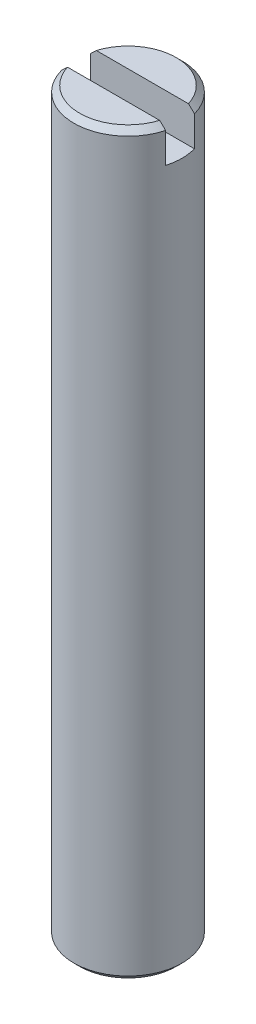
ISO-10303-21;
HEADER;
FILE_DESCRIPTION(('STEP AP214'),'2;1');
FILE_NAME('part.step','',(''),(''),'','','');
FILE_SCHEMA(('AUTOMOTIVE_DESIGN { 1 0 10303 214 1 1 1 1 }'));
ENDSEC;
DATA;
#1=APPLICATION_CONTEXT('core data for automotive mechanical design processes');
#2=APPLICATION_PROTOCOL_DEFINITION('international standard','automotive_design',2000,#1);
#3=PRODUCT_CONTEXT('',#1,'mechanical');
#4=PRODUCT('Part','Part','',(#3));
#5=PRODUCT_RELATED_PRODUCT_CATEGORY('part','',(#4));
#6=PRODUCT_DEFINITION_FORMATION('','',#4);
#7=PRODUCT_DEFINITION_CONTEXT('part definition',#1,'design');
#8=PRODUCT_DEFINITION('design','',#6,#7);
#9=PRODUCT_DEFINITION_SHAPE('','',#8);
#10=(LENGTH_UNIT() NAMED_UNIT(*) SI_UNIT(.MILLI.,.METRE.));
#11=(NAMED_UNIT(*) PLANE_ANGLE_UNIT() SI_UNIT($,.RADIAN.));
#12=(NAMED_UNIT(*) SI_UNIT($,.STERADIAN.) SOLID_ANGLE_UNIT());
#13=UNCERTAINTY_MEASURE_WITH_UNIT(LENGTH_MEASURE(1.E-05),#10,'distance_accuracy_value','');
#14=(GEOMETRIC_REPRESENTATION_CONTEXT(3) GLOBAL_UNCERTAINTY_ASSIGNED_CONTEXT((#13)) GLOBAL_UNIT_ASSIGNED_CONTEXT((#10,
#11,#12)) REPRESENTATION_CONTEXT('',''));
#15=CARTESIAN_POINT('',(0.,0.,0.));
#16=DIRECTION('',(0.,0.,1.));
#17=DIRECTION('',(1.,0.,0.));
#18=AXIS2_PLACEMENT_3D('',#15,#16,#17);
#19=CARTESIAN_POINT('',(0.,2563.,0.));
#20=DIRECTION('',(0.,1.,0.));
#21=DIRECTION('',(0.,0.,1.));
#22=AXIS2_PLACEMENT_3D('',#19,#20,#21);
#23=PLANE('',#22);
#24=DIRECTION('',(-1.,0.,0.));
#25=VECTOR('',#24,1.);
#26=CARTESIAN_POINT('',(0.,2563.,-50.));
#27=LINE('',#26,#25);
#28=CARTESIAN_POINT('',(159.863222787481,2563.,-50.));
#29=VERTEX_POINT('',#28);
#30=CARTESIAN_POINT('',(-159.863222787481,2563.,-50.));
#31=VERTEX_POINT('',#30);
#32=EDGE_CURVE('E109',#29,#31,#27,.T.);
#33=ORIENTED_EDGE('',*,*,#32,.F.);
#34=CARTESIAN_POINT('',(0.,2563.,0.));
#35=DIRECTION('',(0.,1.,0.));
#36=DIRECTION('',(0.,0.,1.));
#37=AXIS2_PLACEMENT_3D('',#34,#35,#36);
#38=CIRCLE('',#37,167.499999999999);
#39=EDGE_CURVE('E123',#29,#31,#38,.T.);
#40=ORIENTED_EDGE('',*,*,#39,.T.);
#41=EDGE_LOOP('',(#33,#40));
#42=FACE_BOUND('',#41,.T.);
#43=ADVANCED_FACE('F33',(#42),#23,.T.);
#44=CARTESIAN_POINT('',(0.,2563.,0.));
#45=DIRECTION('',(0.,-1.,0.));
#46=DIRECTION('',(0.,0.,-1.));
#47=AXIS2_PLACEMENT_3D('',#44,#45,#46);
#48=CYLINDRICAL_SURFACE('',#47,187.5);
#49=CARTESIAN_POINT('',(0.,20.,0.));
#50=DIRECTION('',(0.,1.,0.));
#51=DIRECTION('',(0.,0.,1.));
#52=AXIS2_PLACEMENT_3D('',#49,#50,#51);
#53=CIRCLE('',#52,187.5);
#54=CARTESIAN_POINT('',(0.,20.,187.5));
#55=VERTEX_POINT('',#54);
#56=EDGE_CURVE('E41',#55,#55,#53,.T.);
#57=ORIENTED_EDGE('',*,*,#56,.T.);
#58=EDGE_LOOP('',(#57));
#59=FACE_BOUND('',#58,.T.);
#60=DIRECTION('',(0.,-1.,0.));
#61=VECTOR('',#60,1.);
#62=CARTESIAN_POINT('',(-180.710403685012,2563.,-50.));
#63=LINE('',#62,#61);
#64=CARTESIAN_POINT('',(-180.710403685012,2438.,-50.));
#65=VERTEX_POINT('',#64);
#66=CARTESIAN_POINT('',(-180.710403685012,2543.,-50.));
#67=VERTEX_POINT('',#66);
#68=EDGE_CURVE('E96',#65,#67,#63,.F.);
#69=ORIENTED_EDGE('',*,*,#68,.T.);
#70=CARTESIAN_POINT('',(0.,2543.,0.));
#71=DIRECTION('',(0.,1.,0.));
#72=DIRECTION('',(0.,0.,1.));
#73=AXIS2_PLACEMENT_3D('',#70,#71,#72);
#74=CIRCLE('',#73,187.5);
#75=CARTESIAN_POINT('',(180.710403685012,2543.,-50.));
#76=VERTEX_POINT('',#75);
#77=EDGE_CURVE('E192',#67,#76,#74,.F.);
#78=ORIENTED_EDGE('',*,*,#77,.T.);
#79=DIRECTION('',(0.,-1.,0.));
#80=VECTOR('',#79,1.);
#81=CARTESIAN_POINT('',(180.710403685012,2563.,-50.));
#82=LINE('',#81,#80);
#83=CARTESIAN_POINT('',(180.710403685012,2438.,-50.));
#84=VERTEX_POINT('',#83);
#85=EDGE_CURVE('E117',#76,#84,#82,.T.);
#86=ORIENTED_EDGE('',*,*,#85,.T.);
#87=CARTESIAN_POINT('',(0.,2438.,0.));
#88=DIRECTION('',(0.,-1.,0.));
#89=DIRECTION('',(0.,0.,-1.));
#90=AXIS2_PLACEMENT_3D('',#87,#88,#89);
#91=CIRCLE('',#90,187.5);
#92=CARTESIAN_POINT('',(180.710403685012,2438.,49.9999999999999));
#93=VERTEX_POINT('',#92);
#94=EDGE_CURVE('E108',#84,#93,#91,.T.);
#95=ORIENTED_EDGE('',*,*,#94,.T.);
#96=DIRECTION('',(0.,-1.,0.));
#97=VECTOR('',#96,1.);
#98=CARTESIAN_POINT('',(180.710403685012,2563.,49.9999999999999));
#99=LINE('',#98,#97);
#100=CARTESIAN_POINT('',(180.710403685012,2543.,49.9999999999999));
#101=VERTEX_POINT('',#100);
#102=EDGE_CURVE('E97',#93,#101,#99,.F.);
#103=ORIENTED_EDGE('',*,*,#102,.T.);
#104=CARTESIAN_POINT('',(0.,2543.,0.));
#105=DIRECTION('',(0.,1.,0.));
#106=DIRECTION('',(0.,0.,1.));
#107=AXIS2_PLACEMENT_3D('',#104,#105,#106);
#108=CIRCLE('',#107,187.5);
#109=CARTESIAN_POINT('',(-180.710403685012,2543.,50.));
#110=VERTEX_POINT('',#109);
#111=EDGE_CURVE('E94',#101,#110,#108,.F.);
#112=ORIENTED_EDGE('',*,*,#111,.T.);
#113=DIRECTION('',(0.,-1.,0.));
#114=VECTOR('',#113,1.);
#115=CARTESIAN_POINT('',(-180.710403685012,2563.,50.));
#116=LINE('',#115,#114);
#117=CARTESIAN_POINT('',(-180.710403685012,2438.,50.));
#118=VERTEX_POINT('',#117);
#119=EDGE_CURVE('E88',#110,#118,#116,.T.);
#120=ORIENTED_EDGE('',*,*,#119,.T.);
#121=EDGE_CURVE('E92',#118,#65,#91,.T.);
#122=ORIENTED_EDGE('',*,*,#121,.T.);
#123=EDGE_LOOP('',(#69,#78,#86,#95,#103,#112,#120,#122));
#124=FACE_BOUND('',#123,.T.);
#125=ADVANCED_FACE('F91',(#59,#124),#48,.T.);
#126=DIRECTION('',(1.,0.,0.));
#127=VECTOR('',#126,1.);
#128=CARTESIAN_POINT('',(0.,2563.,50.));
#129=LINE('',#128,#127);
#130=CARTESIAN_POINT('',(-159.863222787481,2563.,50.));
#131=VERTEX_POINT('',#130);
#132=CARTESIAN_POINT('',(159.863222787481,2563.,49.9999999999999));
#133=VERTEX_POINT('',#132);
#134=EDGE_CURVE('E119',#131,#133,#129,.T.);
#135=ORIENTED_EDGE('',*,*,#134,.F.);
#136=CARTESIAN_POINT('',(0.,2563.,0.));
#137=DIRECTION('',(0.,1.,0.));
#138=DIRECTION('',(0.,0.,1.));
#139=AXIS2_PLACEMENT_3D('',#136,#137,#138);
#140=CIRCLE('',#139,167.499999999999);
#141=EDGE_CURVE('E191',#131,#133,#140,.T.);
#142=ORIENTED_EDGE('',*,*,#141,.T.);
#143=EDGE_LOOP('',(#135,#142));
#144=FACE_BOUND('',#143,.T.);
#145=ADVANCED_FACE('F153',(#144),#23,.T.);
#146=CARTESIAN_POINT('',(0.,0.,0.));
#147=DIRECTION('',(0.,1.,0.));
#148=DIRECTION('',(0.,0.,1.));
#149=AXIS2_PLACEMENT_3D('',#146,#147,#148);
#150=PLANE('',#149);
#151=CARTESIAN_POINT('',(0.,0.,0.));
#152=DIRECTION('',(0.,1.,0.));
#153=DIRECTION('',(0.,0.,1.));
#154=AXIS2_PLACEMENT_3D('',#151,#152,#153);
#155=CIRCLE('',#154,167.5);
#156=CARTESIAN_POINT('',(0.,0.,167.5));
#157=VERTEX_POINT('',#156);
#158=EDGE_CURVE('E11',#157,#157,#155,.F.);
#159=ORIENTED_EDGE('',*,*,#158,.T.);
#160=EDGE_LOOP('',(#159));
#161=FACE_BOUND('',#160,.T.);
#162=ADVANCED_FACE('F185',(#161),#150,.F.);
#163=CARTESIAN_POINT('',(0.,2438.,0.));
#164=DIRECTION('',(0.,-1.,0.));
#165=DIRECTION('',(0.,0.,-1.));
#166=AXIS2_PLACEMENT_3D('',#163,#164,#165);
#167=PLANE('',#166);
#168=DIRECTION('',(-1.,0.,0.));
#169=VECTOR('',#168,1.);
#170=CARTESIAN_POINT('',(187.5,2438.,-50.));
#171=LINE('',#170,#169);
#172=EDGE_CURVE('E107',#84,#65,#171,.T.);
#173=ORIENTED_EDGE('',*,*,#172,.T.);
#174=ORIENTED_EDGE('',*,*,#121,.F.);
#175=DIRECTION('',(1.,0.,0.));
#176=VECTOR('',#175,1.);
#177=CARTESIAN_POINT('',(187.5,2438.,49.9999999999999));
#178=LINE('',#177,#176);
#179=EDGE_CURVE('E104',#118,#93,#178,.T.);
#180=ORIENTED_EDGE('',*,*,#179,.T.);
#181=ORIENTED_EDGE('',*,*,#94,.F.);
#182=EDGE_LOOP('',(#173,#174,#180,#181));
#183=FACE_BOUND('',#182,.T.);
#184=ADVANCED_FACE('F102',(#183),#167,.F.);
#185=CARTESIAN_POINT('',(187.5,2438.,-50.));
#186=DIRECTION('',(0.,0.,-1.));
#187=DIRECTION('',(-1.,0.,0.));
#188=AXIS2_PLACEMENT_3D('',#185,#186,#187);
#189=PLANE('',#188);
#190=ORIENTED_EDGE('',*,*,#32,.T.);
#191=CARTESIAN_POINT('',(-159.863222787481,2563.,-50.));
#192=CARTESIAN_POINT('',(-161.604792376817,2561.33782499592,-50.));
#193=CARTESIAN_POINT('',(-163.345161172061,2559.67439242838,-50.));
#194=CARTESIAN_POINT('',(-166.823685950107,2556.34522028857,-50.));
#195=CARTESIAN_POINT('',(-168.561841936188,2554.67948071973,-50.));
#196=CARTESIAN_POINT('',(-172.036134637373,2551.34589815081,-50.));
#197=CARTESIAN_POINT('',(-173.772271352944,2549.67805515121,-50.));
#198=CARTESIAN_POINT('',(-177.242689438856,2546.34043476965,-50.));
#199=CARTESIAN_POINT('',(-178.97697080644,2544.67065738482,-50.));
#200=CARTESIAN_POINT('',(-180.710403685012,2543.,-50.));
#201=B_SPLINE_CURVE_WITH_KNOTS('',3,(#191,#192,#193,#194,#195,#196,#197,#198,#199,#200),
.UNSPECIFIED.,.F.,.F.,(4,2,2,2,4),(0.,7.2223954411048,14.4447801615823,21.6671632050283,
28.8895569651284),.UNSPECIFIED.);
#202=EDGE_CURVE('E134',#31,#67,#201,.T.);
#203=ORIENTED_EDGE('',*,*,#202,.T.);
#204=ORIENTED_EDGE('',*,*,#68,.F.);
#205=ORIENTED_EDGE('',*,*,#172,.F.);
#206=ORIENTED_EDGE('',*,*,#85,.F.);
#207=CARTESIAN_POINT('',(180.710403685012,2543.,-50.));
#208=CARTESIAN_POINT('',(178.97697080644,2544.67065738482,-50.));
#209=CARTESIAN_POINT('',(177.242689438856,2546.34043476965,-50.));
#210=CARTESIAN_POINT('',(173.772271352944,2549.67805515121,-50.));
#211=CARTESIAN_POINT('',(172.036134637372,2551.34589815081,-50.));
#212=CARTESIAN_POINT('',(168.561841936188,2554.67948071973,-50.));
#213=CARTESIAN_POINT('',(166.823685950107,2556.34522028857,-50.));
#214=CARTESIAN_POINT('',(163.345161172061,2559.67439242838,-50.));
#215=CARTESIAN_POINT('',(161.604792376816,2561.33782499592,-50.));
#216=CARTESIAN_POINT('',(159.863222787481,2563.,-50.));
#217=B_SPLINE_CURVE_WITH_KNOTS('',3,(#207,#208,#209,#210,#211,#212,#213,#214,#215,#216),
.UNSPECIFIED.,.F.,.F.,(4,2,2,2,4),(0.,7.22239376010024,14.4447768035461,21.6671615240236,
28.8895569651285),.UNSPECIFIED.);
#218=EDGE_CURVE('E126',#76,#29,#217,.T.);
#219=ORIENTED_EDGE('',*,*,#218,.T.);
#220=EDGE_LOOP('',(#190,#203,#204,#205,#206,#219));
#221=FACE_BOUND('',#220,.T.);
#222=ADVANCED_FACE('F143',(#221),#189,.F.);
#223=CARTESIAN_POINT('',(187.5,2438.,49.9999999999999));
#224=DIRECTION('',(0.,0.,1.));
#225=DIRECTION('',(1.,0.,0.));
#226=AXIS2_PLACEMENT_3D('',#223,#224,#225);
#227=PLANE('',#226);
#228=ORIENTED_EDGE('',*,*,#134,.T.);
#229=CARTESIAN_POINT('',(159.863222787481,2563.,49.9999999999999));
#230=CARTESIAN_POINT('',(161.604792376817,2561.33782499592,49.9999999999999));
#231=CARTESIAN_POINT('',(163.345161172061,2559.67439242838,49.9999999999999));
#232=CARTESIAN_POINT('',(166.823685950107,2556.34522028857,49.9999999999999));
#233=CARTESIAN_POINT('',(168.561841936188,2554.67948071973,49.9999999999999));
#234=CARTESIAN_POINT('',(172.036134637373,2551.34589815081,49.9999999999999));
#235=CARTESIAN_POINT('',(173.772271352944,2549.67805515121,49.9999999999999));
#236=CARTESIAN_POINT('',(177.242689438856,2546.34043476965,49.9999999999999));
#237=CARTESIAN_POINT('',(178.97697080644,2544.67065738482,49.9999999999999));
#238=CARTESIAN_POINT('',(180.710403685012,2543.,49.9999999999999));
#239=B_SPLINE_CURVE_WITH_KNOTS('',3,(#229,#230,#231,#232,#233,#234,#235,#236,#237,#238),
.UNSPECIFIED.,.F.,.F.,(4,2,2,2,4),(0.,7.22239544110482,14.4447801615824,21.6671632050283,
28.8895569651284),.UNSPECIFIED.);
#240=EDGE_CURVE('E48',#133,#101,#239,.T.);
#241=ORIENTED_EDGE('',*,*,#240,.T.);
#242=ORIENTED_EDGE('',*,*,#102,.F.);
#243=ORIENTED_EDGE('',*,*,#179,.F.);
#244=ORIENTED_EDGE('',*,*,#119,.F.);
#245=CARTESIAN_POINT('',(-180.710403685012,2543.,50.));
#246=CARTESIAN_POINT('',(-178.97697080644,2544.67065738482,50.));
#247=CARTESIAN_POINT('',(-177.242689438856,2546.34043476965,50.));
#248=CARTESIAN_POINT('',(-173.772271352944,2549.67805515121,50.));
#249=CARTESIAN_POINT('',(-172.036134637372,2551.34589815081,50.));
#250=CARTESIAN_POINT('',(-168.561841936188,2554.67948071973,50.));
#251=CARTESIAN_POINT('',(-166.823685950107,2556.34522028857,50.));
#252=CARTESIAN_POINT('',(-163.345161172061,2559.67439242838,50.));
#253=CARTESIAN_POINT('',(-161.604792376816,2561.33782499592,50.));
#254=CARTESIAN_POINT('',(-159.863222787481,2563.,50.));
#255=B_SPLINE_CURVE_WITH_KNOTS('',3,(#245,#246,#247,#248,#249,#250,#251,#252,#253,#254),
.UNSPECIFIED.,.F.,.F.,(4,2,2,2,4),(0.,7.22239376010024,14.4447768035461,21.6671615240236,
28.8895569651285),.UNSPECIFIED.);
#256=EDGE_CURVE('E56',#110,#131,#255,.T.);
#257=ORIENTED_EDGE('',*,*,#256,.T.);
#258=EDGE_LOOP('',(#228,#241,#242,#243,#244,#257));
#259=FACE_BOUND('',#258,.T.);
#260=ADVANCED_FACE('F111',(#259),#227,.F.);
#261=CARTESIAN_POINT('',(0.,2563.,0.));
#262=DIRECTION('',(0.,-1.,0.));
#263=DIRECTION('',(0.,0.,-1.));
#264=AXIS2_PLACEMENT_3D('',#261,#262,#263);
#265=CONICAL_SURFACE('',#264,167.499999999999,0.785398163397443);
#266=ORIENTED_EDGE('',*,*,#218,.F.);
#267=ORIENTED_EDGE('',*,*,#77,.F.);
#268=ORIENTED_EDGE('',*,*,#202,.F.);
#269=ORIENTED_EDGE('',*,*,#39,.F.);
#270=EDGE_LOOP('',(#266,#267,#268,#269));
#271=FACE_BOUND('',#270,.T.);
#272=ADVANCED_FACE('F140',(#271),#265,.T.);
#273=CARTESIAN_POINT('',(0.,2563.,0.));
#274=DIRECTION('',(0.,-1.,0.));
#275=DIRECTION('',(0.,0.,-1.));
#276=AXIS2_PLACEMENT_3D('',#273,#274,#275);
#277=CONICAL_SURFACE('',#276,167.499999999999,0.785398163397443);
#278=ORIENTED_EDGE('',*,*,#256,.F.);
#279=ORIENTED_EDGE('',*,*,#111,.F.);
#280=ORIENTED_EDGE('',*,*,#240,.F.);
#281=ORIENTED_EDGE('',*,*,#141,.F.);
#282=EDGE_LOOP('',(#278,#279,#280,#281));
#283=FACE_BOUND('',#282,.T.);
#284=ADVANCED_FACE('F167',(#283),#277,.T.);
#285=CARTESIAN_POINT('',(0.,20.,0.));
#286=DIRECTION('',(0.,1.,0.));
#287=DIRECTION('',(0.,0.,1.));
#288=AXIS2_PLACEMENT_3D('',#285,#286,#287);
#289=CONICAL_SURFACE('',#288,187.5,0.785398163397443);
#290=ORIENTED_EDGE('',*,*,#158,.F.);
#291=EDGE_LOOP('',(#290));
#292=FACE_BOUND('',#291,.T.);
#293=ORIENTED_EDGE('',*,*,#56,.F.);
#294=EDGE_LOOP('',(#293));
#295=FACE_BOUND('',#294,.T.);
#296=ADVANCED_FACE('F35',(#292,#295),#289,.T.);
#297=CLOSED_SHELL('',(#43,#125,#145,#162,#184,#222,#260,#272,#284,#296));
#298=MANIFOLD_SOLID_BREP('B2',#297);
#299=ADVANCED_BREP_SHAPE_REPRESENTATION('',(#18,#298),#14);
#300=SHAPE_DEFINITION_REPRESENTATION(#9,#299);
ENDSEC;
END-ISO-10303-21;
